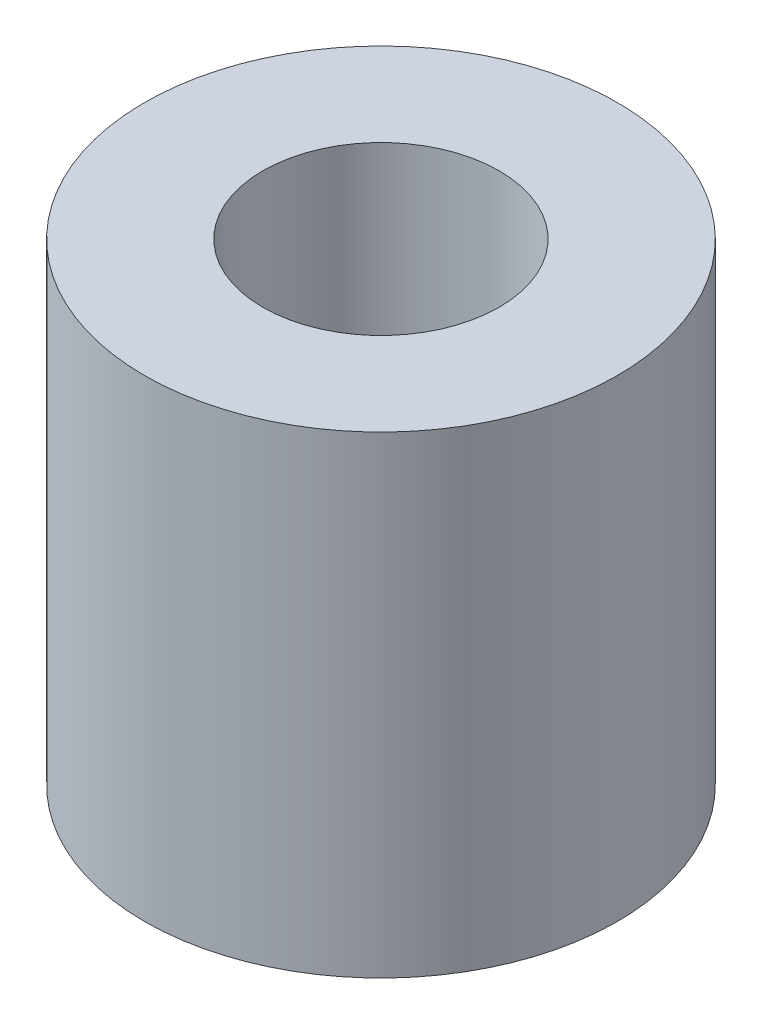
ISO-10303-21;
HEADER;
FILE_DESCRIPTION(('STEP AP214'),'2;1');
FILE_NAME('part.step','',(''),(''),'','','');
FILE_SCHEMA(('AUTOMOTIVE_DESIGN { 1 0 10303 214 1 1 1 1 }'));
ENDSEC;
DATA;
#1=APPLICATION_CONTEXT('core data for automotive mechanical design processes');
#2=APPLICATION_PROTOCOL_DEFINITION('international standard','automotive_design',2000,#1);
#3=PRODUCT_CONTEXT('',#1,'mechanical');
#4=PRODUCT('Part','Part','',(#3));
#5=PRODUCT_RELATED_PRODUCT_CATEGORY('part','',(#4));
#6=PRODUCT_DEFINITION_FORMATION('','',#4);
#7=PRODUCT_DEFINITION_CONTEXT('part definition',#1,'design');
#8=PRODUCT_DEFINITION('design','',#6,#7);
#9=PRODUCT_DEFINITION_SHAPE('','',#8);
#10=(LENGTH_UNIT() NAMED_UNIT(*) SI_UNIT(.MILLI.,.METRE.));
#11=(NAMED_UNIT(*) PLANE_ANGLE_UNIT() SI_UNIT($,.RADIAN.));
#12=(NAMED_UNIT(*) SI_UNIT($,.STERADIAN.) SOLID_ANGLE_UNIT());
#13=UNCERTAINTY_MEASURE_WITH_UNIT(LENGTH_MEASURE(1.E-05),#10,'distance_accuracy_value','');
#14=(GEOMETRIC_REPRESENTATION_CONTEXT(3) GLOBAL_UNCERTAINTY_ASSIGNED_CONTEXT((#13)) GLOBAL_UNIT_ASSIGNED_CONTEXT((#10,
#11,#12)) REPRESENTATION_CONTEXT('',''));
#15=CARTESIAN_POINT('',(0.,0.,0.));
#16=DIRECTION('',(0.,0.,1.));
#17=DIRECTION('',(1.,0.,0.));
#18=AXIS2_PLACEMENT_3D('',#15,#16,#17);
#19=CARTESIAN_POINT('',(0.,5.08,0.));
#20=DIRECTION('',(0.,1.,0.));
#21=DIRECTION('',(0.,0.,1.));
#22=AXIS2_PLACEMENT_3D('',#19,#20,#21);
#23=PLANE('',#22);
#24=CARTESIAN_POINT('',(0.,5.08,0.));
#25=DIRECTION('',(0.,1.,0.));
#26=DIRECTION('',(0.,0.,1.));
#27=AXIS2_PLACEMENT_3D('',#24,#25,#26);
#28=CIRCLE('',#27,2.54);
#29=CARTESIAN_POINT('',(0.,5.08,2.54));
#30=VERTEX_POINT('',#29);
#31=EDGE_CURVE('E10',#30,#30,#28,.T.);
#32=ORIENTED_EDGE('',*,*,#31,.T.);
#33=EDGE_LOOP('',(#32));
#34=FACE_BOUND('',#33,.T.);
#35=CARTESIAN_POINT('',(0.,5.08,0.));
#36=DIRECTION('',(0.,1.,0.));
#37=DIRECTION('',(0.,0.,1.));
#38=AXIS2_PLACEMENT_3D('',#35,#36,#37);
#39=CIRCLE('',#38,1.27);
#40=CARTESIAN_POINT('',(0.,5.08,1.27));
#41=VERTEX_POINT('',#40);
#42=EDGE_CURVE('E42',#41,#41,#39,.T.);
#43=ORIENTED_EDGE('',*,*,#42,.F.);
#44=EDGE_LOOP('',(#43));
#45=FACE_BOUND('',#44,.T.);
#46=ADVANCED_FACE('F31',(#34,#45),#23,.T.);
#47=CARTESIAN_POINT('',(0.,0.,0.));
#48=DIRECTION('',(0.,1.,0.));
#49=DIRECTION('',(0.,0.,1.));
#50=AXIS2_PLACEMENT_3D('',#47,#48,#49);
#51=PLANE('',#50);
#52=CARTESIAN_POINT('',(0.,0.,0.));
#53=DIRECTION('',(0.,1.,0.));
#54=DIRECTION('',(0.,0.,1.));
#55=AXIS2_PLACEMENT_3D('',#52,#53,#54);
#56=CIRCLE('',#55,2.54);
#57=CARTESIAN_POINT('',(0.,0.,2.54));
#58=VERTEX_POINT('',#57);
#59=EDGE_CURVE('E35',#58,#58,#56,.T.);
#60=ORIENTED_EDGE('',*,*,#59,.F.);
#61=EDGE_LOOP('',(#60));
#62=FACE_BOUND('',#61,.T.);
#63=CARTESIAN_POINT('',(0.,0.,0.));
#64=DIRECTION('',(0.,1.,0.));
#65=DIRECTION('',(0.,0.,1.));
#66=AXIS2_PLACEMENT_3D('',#63,#64,#65);
#67=CIRCLE('',#66,1.27);
#68=CARTESIAN_POINT('',(0.,0.,1.27));
#69=VERTEX_POINT('',#68);
#70=EDGE_CURVE('E44',#69,#69,#67,.T.);
#71=ORIENTED_EDGE('',*,*,#70,.T.);
#72=EDGE_LOOP('',(#71));
#73=FACE_BOUND('',#72,.T.);
#74=ADVANCED_FACE('F54',(#62,#73),#51,.F.);
#75=CARTESIAN_POINT('',(0.,5.08,0.));
#76=DIRECTION('',(0.,-1.,0.));
#77=DIRECTION('',(0.,0.,-1.));
#78=AXIS2_PLACEMENT_3D('',#75,#76,#77);
#79=CYLINDRICAL_SURFACE('',#78,2.54);
#80=ORIENTED_EDGE('',*,*,#31,.F.);
#81=EDGE_LOOP('',(#80));
#82=FACE_BOUND('',#81,.T.);
#83=ORIENTED_EDGE('',*,*,#59,.T.);
#84=EDGE_LOOP('',(#83));
#85=FACE_BOUND('',#84,.T.);
#86=ADVANCED_FACE('F33',(#82,#85),#79,.T.);
#87=CARTESIAN_POINT('',(0.,5.08,0.));
#88=DIRECTION('',(0.,-1.,0.));
#89=DIRECTION('',(0.,0.,-1.));
#90=AXIS2_PLACEMENT_3D('',#87,#88,#89);
#91=CYLINDRICAL_SURFACE('',#90,1.27);
#92=ORIENTED_EDGE('',*,*,#42,.T.);
#93=EDGE_LOOP('',(#92));
#94=FACE_BOUND('',#93,.T.);
#95=ORIENTED_EDGE('',*,*,#70,.F.);
#96=EDGE_LOOP('',(#95));
#97=FACE_BOUND('',#96,.T.);
#98=ADVANCED_FACE('F50',(#94,#97),#91,.F.);
#99=CLOSED_SHELL('',(#46,#74,#86,#98));
#100=MANIFOLD_SOLID_BREP('B2',#99);
#101=ADVANCED_BREP_SHAPE_REPRESENTATION('',(#18,#100),#14);
#102=SHAPE_DEFINITION_REPRESENTATION(#9,#101);
ENDSEC;
END-ISO-10303-21;
